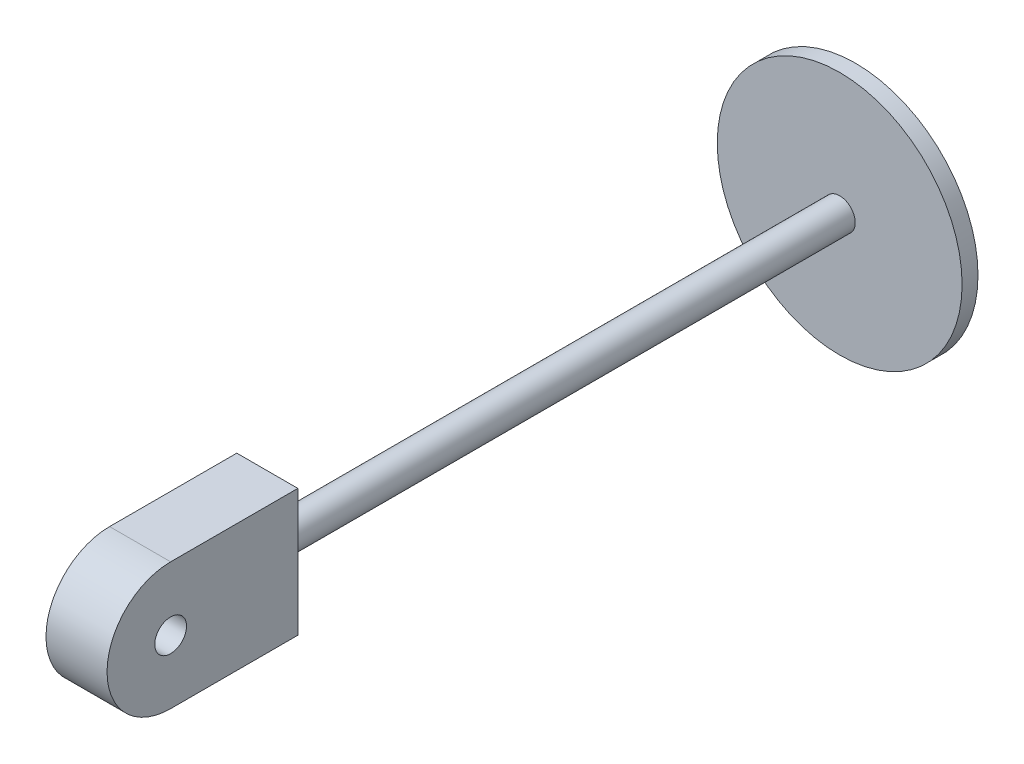
ISO-10303-21;
HEADER;
FILE_DESCRIPTION(('STEP AP214'),'2;1');
FILE_NAME('part.step','',(''),(''),'','','');
FILE_SCHEMA(('AUTOMOTIVE_DESIGN { 1 0 10303 214 1 1 1 1 }'));
ENDSEC;
DATA;
#1=APPLICATION_CONTEXT('core data for automotive mechanical design processes');
#2=APPLICATION_PROTOCOL_DEFINITION('international standard','automotive_design',2000,#1);
#3=PRODUCT_CONTEXT('',#1,'mechanical');
#4=PRODUCT('Part','Part','',(#3));
#5=PRODUCT_RELATED_PRODUCT_CATEGORY('part','',(#4));
#6=PRODUCT_DEFINITION_FORMATION('','',#4);
#7=PRODUCT_DEFINITION_CONTEXT('part definition',#1,'design');
#8=PRODUCT_DEFINITION('design','',#6,#7);
#9=PRODUCT_DEFINITION_SHAPE('','',#8);
#10=(LENGTH_UNIT() NAMED_UNIT(*) SI_UNIT(.MILLI.,.METRE.));
#11=(NAMED_UNIT(*) PLANE_ANGLE_UNIT() SI_UNIT($,.RADIAN.));
#12=(NAMED_UNIT(*) SI_UNIT($,.STERADIAN.) SOLID_ANGLE_UNIT());
#13=UNCERTAINTY_MEASURE_WITH_UNIT(LENGTH_MEASURE(1.E-05),#10,'distance_accuracy_value','');
#14=(GEOMETRIC_REPRESENTATION_CONTEXT(3) GLOBAL_UNCERTAINTY_ASSIGNED_CONTEXT((#13)) GLOBAL_UNIT_ASSIGNED_CONTEXT((#10,
#11,#12)) REPRESENTATION_CONTEXT('',''));
#15=CARTESIAN_POINT('',(0.,0.,0.));
#16=DIRECTION('',(0.,0.,1.));
#17=DIRECTION('',(1.,0.,0.));
#18=AXIS2_PLACEMENT_3D('',#15,#16,#17);
#19=CARTESIAN_POINT('',(0.,0.,0.625));
#20=DIRECTION('',(0.,0.,-1.));
#21=DIRECTION('',(-1.,0.,0.));
#22=AXIS2_PLACEMENT_3D('',#19,#20,#21);
#23=CYLINDRICAL_SURFACE('',#22,9.625);
#24=CARTESIAN_POINT('',(0.,0.,0.625));
#25=DIRECTION('',(0.,0.,1.));
#26=DIRECTION('',(1.,0.,0.));
#27=AXIS2_PLACEMENT_3D('',#24,#25,#26);
#28=CIRCLE('',#27,9.625);
#29=CARTESIAN_POINT('',(9.625,0.,0.625));
#30=VERTEX_POINT('',#29);
#31=EDGE_CURVE('E11',#30,#30,#28,.T.);
#32=ORIENTED_EDGE('',*,*,#31,.F.);
#33=EDGE_LOOP('',(#32));
#34=FACE_BOUND('',#33,.T.);
#35=CARTESIAN_POINT('',(0.,0.,-0.625));
#36=DIRECTION('',(0.,0.,1.));
#37=DIRECTION('',(1.,0.,0.));
#38=AXIS2_PLACEMENT_3D('',#35,#36,#37);
#39=CIRCLE('',#38,9.625);
#40=CARTESIAN_POINT('',(9.625,0.,-0.625));
#41=VERTEX_POINT('',#40);
#42=EDGE_CURVE('E40',#41,#41,#39,.T.);
#43=ORIENTED_EDGE('',*,*,#42,.T.);
#44=EDGE_LOOP('',(#43));
#45=FACE_BOUND('',#44,.T.);
#46=ADVANCED_FACE('F37',(#34,#45),#23,.T.);
#47=CARTESIAN_POINT('',(0.,0.,0.625));
#48=DIRECTION('',(0.,0.,1.));
#49=DIRECTION('',(1.,0.,0.));
#50=AXIS2_PLACEMENT_3D('',#47,#48,#49);
#51=PLANE('',#50);
#52=CARTESIAN_POINT('',(0.,0.,0.625));
#53=DIRECTION('',(0.,0.,1.));
#54=DIRECTION('',(1.,0.,0.));
#55=AXIS2_PLACEMENT_3D('',#52,#53,#54);
#56=CIRCLE('',#55,1.225);
#57=CARTESIAN_POINT('',(-1.225,0.,0.624999999999994));
#58=VERTEX_POINT('',#57);
#59=EDGE_CURVE('E114',#58,#58,#56,.T.);
#60=ORIENTED_EDGE('',*,*,#59,.F.);
#61=EDGE_LOOP('',(#60));
#62=FACE_BOUND('',#61,.T.);
#63=ORIENTED_EDGE('',*,*,#31,.T.);
#64=EDGE_LOOP('',(#63));
#65=FACE_BOUND('',#64,.T.);
#66=ADVANCED_FACE('F123',(#62,#65),#51,.T.);
#67=CARTESIAN_POINT('',(0.,0.,-0.625));
#68=DIRECTION('',(0.,0.,1.));
#69=DIRECTION('',(1.,0.,0.));
#70=AXIS2_PLACEMENT_3D('',#67,#68,#69);
#71=PLANE('',#70);
#72=ORIENTED_EDGE('',*,*,#42,.F.);
#73=EDGE_LOOP('',(#72));
#74=FACE_BOUND('',#73,.T.);
#75=ADVANCED_FACE('F126',(#74),#71,.F.);
#76=CARTESIAN_POINT('',(0.,0.,45.625));
#77=DIRECTION('',(0.,0.,-1.));
#78=DIRECTION('',(-1.,0.,0.));
#79=AXIS2_PLACEMENT_3D('',#76,#77,#78);
#80=CYLINDRICAL_SURFACE('',#79,1.225);
#81=CARTESIAN_POINT('',(0.,0.,45.625));
#82=DIRECTION('',(0.,0.,1.));
#83=DIRECTION('',(1.,0.,0.));
#84=AXIS2_PLACEMENT_3D('',#81,#82,#83);
#85=CIRCLE('',#84,1.225);
#86=CARTESIAN_POINT('',(-1.225,0.,45.625));
#87=VERTEX_POINT('',#86);
#88=EDGE_CURVE('E115',#87,#87,#85,.T.);
#89=CARTESIAN_POINT('',(-1.225,0.,45.625));
#90=CARTESIAN_POINT('',(-1.225,0.,45.15625));
#91=CARTESIAN_POINT('',(-1.225,0.,44.6875));
#92=CARTESIAN_POINT('',(-1.225,0.,43.75));
#93=CARTESIAN_POINT('',(-1.225,0.,43.28125));
#94=CARTESIAN_POINT('',(-1.225,0.,42.34375));
#95=CARTESIAN_POINT('',(-1.225,0.,41.875));
#96=CARTESIAN_POINT('',(-1.225,0.,40.9375));
#97=CARTESIAN_POINT('',(-1.225,0.,40.46875));
#98=CARTESIAN_POINT('',(-1.225,0.,39.53125));
#99=CARTESIAN_POINT('',(-1.225,0.,39.0625));
#100=CARTESIAN_POINT('',(-1.225,0.,38.125));
#101=CARTESIAN_POINT('',(-1.225,0.,37.65625));
#102=CARTESIAN_POINT('',(-1.225,0.,36.71875));
#103=CARTESIAN_POINT('',(-1.225,0.,36.25));
#104=CARTESIAN_POINT('',(-1.225,0.,35.3125));
#105=CARTESIAN_POINT('',(-1.225,0.,34.84375));
#106=CARTESIAN_POINT('',(-1.225,0.,33.90625));
#107=CARTESIAN_POINT('',(-1.225,0.,33.4375));
#108=CARTESIAN_POINT('',(-1.225,0.,32.5));
#109=CARTESIAN_POINT('',(-1.225,0.,32.03125));
#110=CARTESIAN_POINT('',(-1.225,0.,31.09375));
#111=CARTESIAN_POINT('',(-1.225,0.,30.625));
#112=CARTESIAN_POINT('',(-1.225,0.,29.6875));
#113=CARTESIAN_POINT('',(-1.225,0.,29.21875));
#114=CARTESIAN_POINT('',(-1.225,0.,28.28125));
#115=CARTESIAN_POINT('',(-1.225,0.,27.8125));
#116=CARTESIAN_POINT('',(-1.225,0.,26.875));
#117=CARTESIAN_POINT('',(-1.225,0.,26.40625));
#118=CARTESIAN_POINT('',(-1.225,0.,25.46875));
#119=CARTESIAN_POINT('',(-1.225,0.,25.));
#120=CARTESIAN_POINT('',(-1.225,0.,24.0625));
#121=CARTESIAN_POINT('',(-1.225,0.,23.59375));
#122=CARTESIAN_POINT('',(-1.225,0.,22.65625));
#123=CARTESIAN_POINT('',(-1.225,0.,22.1875));
#124=CARTESIAN_POINT('',(-1.225,0.,21.25));
#125=CARTESIAN_POINT('',(-1.225,0.,20.78125));
#126=CARTESIAN_POINT('',(-1.225,0.,19.84375));
#127=CARTESIAN_POINT('',(-1.225,0.,19.375));
#128=CARTESIAN_POINT('',(-1.225,0.,18.4375));
#129=CARTESIAN_POINT('',(-1.225,0.,17.96875));
#130=CARTESIAN_POINT('',(-1.225,0.,17.03125));
#131=CARTESIAN_POINT('',(-1.225,0.,16.5625));
#132=CARTESIAN_POINT('',(-1.225,0.,15.625));
#133=CARTESIAN_POINT('',(-1.225,0.,15.15625));
#134=CARTESIAN_POINT('',(-1.225,0.,14.21875));
#135=CARTESIAN_POINT('',(-1.225,0.,13.75));
#136=CARTESIAN_POINT('',(-1.225,0.,12.8125));
#137=CARTESIAN_POINT('',(-1.225,0.,12.34375));
#138=CARTESIAN_POINT('',(-1.225,0.,11.40625));
#139=CARTESIAN_POINT('',(-1.225,0.,10.9375));
#140=CARTESIAN_POINT('',(-1.225,0.,9.99999999999999));
#141=CARTESIAN_POINT('',(-1.225,0.,9.53124999999999));
#142=CARTESIAN_POINT('',(-1.225,0.,8.59374999999999));
#143=CARTESIAN_POINT('',(-1.225,0.,8.12499999999999));
#144=CARTESIAN_POINT('',(-1.225,0.,7.18749999999999));
#145=CARTESIAN_POINT('',(-1.225,0.,6.71874999999999));
#146=CARTESIAN_POINT('',(-1.225,0.,5.78124999999999));
#147=CARTESIAN_POINT('',(-1.225,0.,5.31249999999999));
#148=CARTESIAN_POINT('',(-1.225,0.,4.37499999999999));
#149=CARTESIAN_POINT('',(-1.225,0.,3.90625));
#150=CARTESIAN_POINT('',(-1.225,0.,2.96874999999999));
#151=CARTESIAN_POINT('',(-1.225,0.,2.49999999999999));
#152=CARTESIAN_POINT('',(-1.225,0.,1.56249999999999));
#153=CARTESIAN_POINT('',(-1.225,0.,1.09374999999999));
#154=CARTESIAN_POINT('',(-1.225,0.,0.624999999999994));
#155=B_SPLINE_CURVE_WITH_KNOTS('',3,(#89,#90,#91,#92,#93,#94,#95,#96,#97,#98,#99,#100,#101,#102,
#103,#104,#105,#106,#107,#108,#109,#110,#111,#112,#113,#114,#115,#116,#117,#118,#119,#120,#121,
#122,#123,#124,#125,#126,#127,#128,#129,#130,#131,#132,#133,#134,#135,#136,#137,#138,#139,#140,
#141,#142,#143,#144,#145,#146,#147,#148,#149,#150,#151,#152,#153,#154),.UNSPECIFIED.,.F.,.F.,(4,
2,2,2,2,2,2,2,2,2,2,2,2,2,2,2,2,2,2,2,2,2,2,2,2,2,2,2,2,2,2,2,4),(0.,1.40625,2.8125,
4.21874999999999,5.625,7.03125,8.43749999999999,9.84375,11.25,12.65625,14.0625,15.46875,16.875,
18.28125,19.6875,21.09375,22.5,23.90625,25.3125,26.71875,28.125,29.53125,30.9375,32.34375,33.75,
35.15625,36.5625,37.96875,39.375,40.78125,42.1875,43.59375,45.),.UNSPECIFIED.);
#156=EDGE_CURVE('BSEAM121',#87,#58,#155,.T.);
#157=ORIENTED_EDGE('',*,*,#88,.F.);
#158=ORIENTED_EDGE('',*,*,#59,.T.);
#159=ORIENTED_EDGE('',*,*,#156,.T.);
#160=ORIENTED_EDGE('',*,*,#156,.F.);
#161=EDGE_LOOP('',(#157,#159,#158,#160));
#162=FACE_BOUND('',#161,.T.);
#163=ADVANCED_FACE('F121',(#162),#80,.T.);
#164=CARTESIAN_POINT('',(2.4,5.,45.625));
#165=DIRECTION('',(0.,-1.,0.));
#166=DIRECTION('',(0.,0.,-1.));
#167=AXIS2_PLACEMENT_3D('',#164,#165,#166);
#168=PLANE('',#167);
#169=DIRECTION('',(0.,0.,1.));
#170=VECTOR('',#169,1.);
#171=CARTESIAN_POINT('',(-2.4,5.,45.625));
#172=LINE('',#171,#170);
#173=CARTESIAN_POINT('',(-2.4,5.,45.625));
#174=VERTEX_POINT('',#173);
#175=CARTESIAN_POINT('',(-2.4,5.00000000000001,55.625));
#176=VERTEX_POINT('',#175);
#177=EDGE_CURVE('E104',#174,#176,#172,.T.);
#178=ORIENTED_EDGE('',*,*,#177,.T.);
#179=DIRECTION('',(-1.,0.,0.));
#180=VECTOR('',#179,1.);
#181=CARTESIAN_POINT('',(2.4,5.00000000000001,55.625));
#182=LINE('',#181,#180);
#183=CARTESIAN_POINT('',(2.4,5.00000000000001,55.625));
#184=VERTEX_POINT('',#183);
#185=EDGE_CURVE('E95',#184,#176,#182,.T.);
#186=ORIENTED_EDGE('',*,*,#185,.F.);
#187=DIRECTION('',(0.,0.,1.));
#188=VECTOR('',#187,1.);
#189=CARTESIAN_POINT('',(2.4,5.,45.625));
#190=LINE('',#189,#188);
#191=CARTESIAN_POINT('',(2.4,5.,45.625));
#192=VERTEX_POINT('',#191);
#193=EDGE_CURVE('E89',#192,#184,#190,.T.);
#194=ORIENTED_EDGE('',*,*,#193,.F.);
#195=DIRECTION('',(-1.,0.,0.));
#196=VECTOR('',#195,1.);
#197=CARTESIAN_POINT('',(2.4,5.,45.625));
#198=LINE('',#197,#196);
#199=EDGE_CURVE('E100',#192,#174,#198,.T.);
#200=ORIENTED_EDGE('',*,*,#199,.T.);
#201=EDGE_LOOP('',(#178,#186,#194,#200));
#202=FACE_BOUND('',#201,.T.);
#203=ADVANCED_FACE('F139',(#202),#168,.F.);
#204=CARTESIAN_POINT('',(2.4,0.,55.625));
#205=DIRECTION('',(-1.,0.,0.));
#206=DIRECTION('',(0.,0.,1.));
#207=AXIS2_PLACEMENT_3D('',#204,#205,#206);
#208=CYLINDRICAL_SURFACE('',#207,5.);
#209=CARTESIAN_POINT('',(-2.4,0.,55.625));
#210=DIRECTION('',(1.,0.,0.));
#211=DIRECTION('',(0.,0.,-1.));
#212=AXIS2_PLACEMENT_3D('',#209,#210,#211);
#213=CIRCLE('',#212,5.);
#214=CARTESIAN_POINT('',(-2.4,-5.,55.625));
#215=VERTEX_POINT('',#214);
#216=EDGE_CURVE('E94',#176,#215,#213,.T.);
#217=ORIENTED_EDGE('',*,*,#216,.T.);
#218=DIRECTION('',(-1.,0.,0.));
#219=VECTOR('',#218,1.);
#220=CARTESIAN_POINT('',(2.4,-5.,55.625));
#221=LINE('',#220,#219);
#222=CARTESIAN_POINT('',(2.4,-5.,55.625));
#223=VERTEX_POINT('',#222);
#224=EDGE_CURVE('E92',#223,#215,#221,.T.);
#225=ORIENTED_EDGE('',*,*,#224,.F.);
#226=CARTESIAN_POINT('',(2.4,0.,55.625));
#227=DIRECTION('',(1.,0.,0.));
#228=DIRECTION('',(0.,0.,-1.));
#229=AXIS2_PLACEMENT_3D('',#226,#227,#228);
#230=CIRCLE('',#229,5.);
#231=EDGE_CURVE('E84',#184,#223,#230,.T.);
#232=ORIENTED_EDGE('',*,*,#231,.F.);
#233=ORIENTED_EDGE('',*,*,#185,.T.);
#234=EDGE_LOOP('',(#217,#225,#232,#233));
#235=FACE_BOUND('',#234,.T.);
#236=ADVANCED_FACE('F93',(#235),#208,.T.);
#237=CARTESIAN_POINT('',(2.4,-5.,55.625));
#238=DIRECTION('',(0.,1.,0.));
#239=DIRECTION('',(0.,0.,1.));
#240=AXIS2_PLACEMENT_3D('',#237,#238,#239);
#241=PLANE('',#240);
#242=DIRECTION('',(0.,0.,-1.));
#243=VECTOR('',#242,1.);
#244=CARTESIAN_POINT('',(-2.4,-5.,55.625));
#245=LINE('',#244,#243);
#246=CARTESIAN_POINT('',(-2.4,-5.,45.625));
#247=VERTEX_POINT('',#246);
#248=EDGE_CURVE('E70',#215,#247,#245,.T.);
#249=ORIENTED_EDGE('',*,*,#248,.T.);
#250=DIRECTION('',(-1.,0.,0.));
#251=VECTOR('',#250,1.);
#252=CARTESIAN_POINT('',(2.4,-5.,45.625));
#253=LINE('',#252,#251);
#254=CARTESIAN_POINT('',(2.4,-5.,45.625));
#255=VERTEX_POINT('',#254);
#256=EDGE_CURVE('E96',#255,#247,#253,.T.);
#257=ORIENTED_EDGE('',*,*,#256,.F.);
#258=DIRECTION('',(0.,0.,-1.));
#259=VECTOR('',#258,1.);
#260=CARTESIAN_POINT('',(2.4,-5.,55.625));
#261=LINE('',#260,#259);
#262=EDGE_CURVE('E87',#223,#255,#261,.T.);
#263=ORIENTED_EDGE('',*,*,#262,.F.);
#264=ORIENTED_EDGE('',*,*,#224,.T.);
#265=EDGE_LOOP('',(#249,#257,#263,#264));
#266=FACE_BOUND('',#265,.T.);
#267=ADVANCED_FACE('F98',(#266),#241,.F.);
#268=CARTESIAN_POINT('',(2.4,5.,45.625));
#269=DIRECTION('',(0.,0.,1.));
#270=DIRECTION('',(1.,0.,0.));
#271=AXIS2_PLACEMENT_3D('',#268,#269,#270);
#272=PLANE('',#271);
#273=ORIENTED_EDGE('',*,*,#88,.T.);
#274=EDGE_LOOP('',(#273));
#275=FACE_BOUND('',#274,.T.);
#276=DIRECTION('',(0.,1.,0.));
#277=VECTOR('',#276,1.);
#278=CARTESIAN_POINT('',(-2.4,5.,45.625));
#279=LINE('',#278,#277);
#280=EDGE_CURVE('E76',#247,#174,#279,.T.);
#281=ORIENTED_EDGE('',*,*,#280,.T.);
#282=ORIENTED_EDGE('',*,*,#199,.F.);
#283=DIRECTION('',(0.,1.,0.));
#284=VECTOR('',#283,1.);
#285=CARTESIAN_POINT('',(2.4,5.,45.625));
#286=LINE('',#285,#284);
#287=EDGE_CURVE('E53',#255,#192,#286,.T.);
#288=ORIENTED_EDGE('',*,*,#287,.F.);
#289=ORIENTED_EDGE('',*,*,#256,.T.);
#290=EDGE_LOOP('',(#281,#282,#288,#289));
#291=FACE_BOUND('',#290,.T.);
#292=ADVANCED_FACE('F150',(#275,#291),#272,.F.);
#293=CARTESIAN_POINT('',(2.4,0.,55.625));
#294=DIRECTION('',(1.,0.,0.));
#295=DIRECTION('',(0.,0.,-1.));
#296=AXIS2_PLACEMENT_3D('',#293,#294,#295);
#297=PLANE('',#296);
#298=CARTESIAN_POINT('',(2.4,0.,55.625));
#299=DIRECTION('',(1.,0.,0.));
#300=DIRECTION('',(0.,0.,-1.));
#301=AXIS2_PLACEMENT_3D('',#298,#299,#300);
#302=CIRCLE('',#301,1.25);
#303=CARTESIAN_POINT('',(2.4,0.,54.375));
#304=VERTEX_POINT('',#303);
#305=EDGE_CURVE('E107',#304,#304,#302,.T.);
#306=ORIENTED_EDGE('',*,*,#305,.F.);
#307=EDGE_LOOP('',(#306));
#308=FACE_BOUND('',#307,.T.);
#309=ORIENTED_EDGE('',*,*,#193,.T.);
#310=ORIENTED_EDGE('',*,*,#231,.T.);
#311=ORIENTED_EDGE('',*,*,#262,.T.);
#312=ORIENTED_EDGE('',*,*,#287,.T.);
#313=EDGE_LOOP('',(#309,#310,#311,#312));
#314=FACE_BOUND('',#313,.T.);
#315=ADVANCED_FACE('F85',(#308,#314),#297,.T.);
#316=CARTESIAN_POINT('',(-2.4,0.,55.625));
#317=DIRECTION('',(1.,0.,0.));
#318=DIRECTION('',(0.,0.,-1.));
#319=AXIS2_PLACEMENT_3D('',#316,#317,#318);
#320=PLANE('',#319);
#321=CARTESIAN_POINT('',(-2.4,0.,55.625));
#322=DIRECTION('',(-1.,0.,0.));
#323=DIRECTION('',(0.,0.,1.));
#324=AXIS2_PLACEMENT_3D('',#321,#322,#323);
#325=CIRCLE('',#324,1.25);
#326=CARTESIAN_POINT('',(-2.4,0.,56.875));
#327=VERTEX_POINT('',#326);
#328=EDGE_CURVE('E171',#327,#327,#325,.T.);
#329=ORIENTED_EDGE('',*,*,#328,.F.);
#330=EDGE_LOOP('',(#329));
#331=FACE_BOUND('',#330,.T.);
#332=ORIENTED_EDGE('',*,*,#177,.F.);
#333=ORIENTED_EDGE('',*,*,#280,.F.);
#334=ORIENTED_EDGE('',*,*,#248,.F.);
#335=ORIENTED_EDGE('',*,*,#216,.F.);
#336=EDGE_LOOP('',(#332,#333,#334,#335));
#337=FACE_BOUND('',#336,.T.);
#338=ADVANCED_FACE('F154',(#331,#337),#320,.F.);
#339=CARTESIAN_POINT('',(7.6,0.,55.625));
#340=DIRECTION('',(-1.,0.,0.));
#341=DIRECTION('',(0.,0.,1.));
#342=AXIS2_PLACEMENT_3D('',#339,#340,#341);
#343=CYLINDRICAL_SURFACE('',#342,1.25);
#344=ORIENTED_EDGE('',*,*,#305,.T.);
#345=EDGE_LOOP('',(#344));
#346=FACE_BOUND('',#345,.T.);
#347=ORIENTED_EDGE('',*,*,#328,.T.);
#348=EDGE_LOOP('',(#347));
#349=FACE_BOUND('',#348,.T.);
#350=ADVANCED_FACE('F157',(#346,#349),#343,.F.);
#351=CLOSED_SHELL('',(#46,#66,#75,#163,#203,#236,#267,#292,#315,#338,#350));
#352=MANIFOLD_SOLID_BREP('B2',#351);
#353=ADVANCED_BREP_SHAPE_REPRESENTATION('',(#18,#352),#14);
#354=SHAPE_DEFINITION_REPRESENTATION(#9,#353);
ENDSEC;
END-ISO-10303-21;
